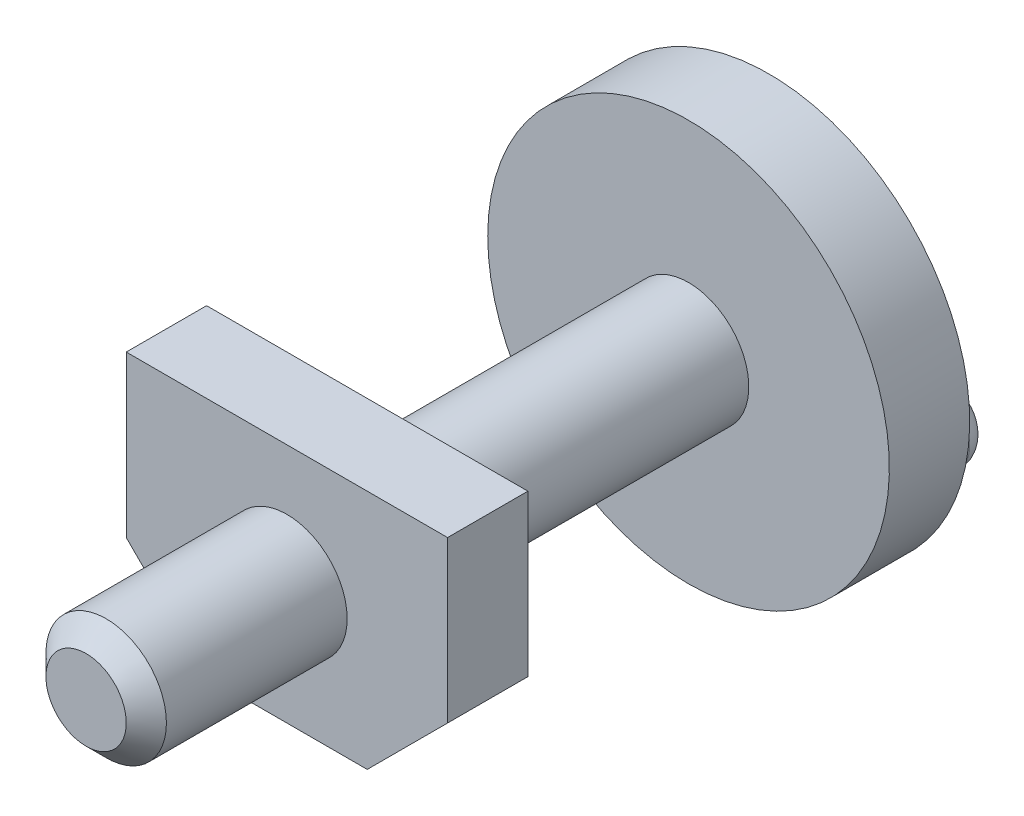
ISO-10303-21;
HEADER;
FILE_DESCRIPTION(('STEP AP214'),'2;1');
FILE_NAME('part.step','',(''),(''),'','','');
FILE_SCHEMA(('AUTOMOTIVE_DESIGN { 1 0 10303 214 1 1 1 1 }'));
ENDSEC;
DATA;
#1=APPLICATION_CONTEXT('core data for automotive mechanical design processes');
#2=APPLICATION_PROTOCOL_DEFINITION('international standard','automotive_design',2000,#1);
#3=PRODUCT_CONTEXT('',#1,'mechanical');
#4=PRODUCT('Part','Part','',(#3));
#5=PRODUCT_RELATED_PRODUCT_CATEGORY('part','',(#4));
#6=PRODUCT_DEFINITION_FORMATION('','',#4);
#7=PRODUCT_DEFINITION_CONTEXT('part definition',#1,'design');
#8=PRODUCT_DEFINITION('design','',#6,#7);
#9=PRODUCT_DEFINITION_SHAPE('','',#8);
#10=(LENGTH_UNIT() NAMED_UNIT(*) SI_UNIT(.MILLI.,.METRE.));
#11=(NAMED_UNIT(*) PLANE_ANGLE_UNIT() SI_UNIT($,.RADIAN.));
#12=(NAMED_UNIT(*) SI_UNIT($,.STERADIAN.) SOLID_ANGLE_UNIT());
#13=UNCERTAINTY_MEASURE_WITH_UNIT(LENGTH_MEASURE(1.E-05),#10,'distance_accuracy_value','');
#14=(GEOMETRIC_REPRESENTATION_CONTEXT(3) GLOBAL_UNCERTAINTY_ASSIGNED_CONTEXT((#13)) GLOBAL_UNIT_ASSIGNED_CONTEXT((#10,
#11,#12)) REPRESENTATION_CONTEXT('',''));
#15=CARTESIAN_POINT('',(0.,0.,0.));
#16=DIRECTION('',(0.,0.,1.));
#17=DIRECTION('',(1.,0.,0.));
#18=AXIS2_PLACEMENT_3D('',#15,#16,#17);
#19=CARTESIAN_POINT('',(0.,0.,150.));
#20=DIRECTION('',(0.,0.,-1.));
#21=DIRECTION('',(-1.,0.,0.));
#22=AXIS2_PLACEMENT_3D('',#19,#20,#21);
#23=CYLINDRICAL_SURFACE('',#22,15.);
#24=CARTESIAN_POINT('',(0.,0.,0.));
#25=DIRECTION('',(0.,0.,-1.));
#26=DIRECTION('',(-1.,0.,0.));
#27=AXIS2_PLACEMENT_3D('',#24,#25,#26);
#28=CIRCLE('',#27,15.);
#29=CARTESIAN_POINT('',(-15.,0.,0.));
#30=VERTEX_POINT('',#29);
#31=EDGE_CURVE('E146',#30,#30,#28,.T.);
#32=ORIENTED_EDGE('',*,*,#31,.F.);
#33=EDGE_LOOP('',(#32));
#34=FACE_BOUND('',#33,.T.);
#35=CARTESIAN_POINT('',(0.,0.,80.));
#36=DIRECTION('',(0.,0.,1.));
#37=DIRECTION('',(1.,0.,0.));
#38=AXIS2_PLACEMENT_3D('',#35,#36,#37);
#39=CIRCLE('',#38,15.);
#40=CARTESIAN_POINT('',(15.,0.,80.));
#41=VERTEX_POINT('',#40);
#42=EDGE_CURVE('E175',#41,#41,#39,.T.);
#43=ORIENTED_EDGE('',*,*,#42,.F.);
#44=EDGE_LOOP('',(#43));
#45=FACE_BOUND('',#44,.T.);
#46=ADVANCED_FACE('F37',(#34,#45),#23,.T.);
#47=CARTESIAN_POINT('',(0.,0.,-20.));
#48=DIRECTION('',(0.,0.,1.));
#49=DIRECTION('',(1.,0.,0.));
#50=AXIS2_PLACEMENT_3D('',#47,#48,#49);
#51=CYLINDRICAL_SURFACE('',#50,50.);
#52=CARTESIAN_POINT('',(0.,0.,-20.));
#53=DIRECTION('',(0.,0.,-1.));
#54=DIRECTION('',(-1.,0.,0.));
#55=AXIS2_PLACEMENT_3D('',#52,#53,#54);
#56=CIRCLE('',#55,50.);
#57=CARTESIAN_POINT('',(0.,-50.,-20.));
#58=VERTEX_POINT('',#57);
#59=EDGE_CURVE('E143',#58,#58,#56,.T.);
#60=ORIENTED_EDGE('',*,*,#59,.F.);
#61=EDGE_LOOP('',(#60));
#62=FACE_BOUND('',#61,.T.);
#63=CARTESIAN_POINT('',(0.,0.,0.));
#64=DIRECTION('',(0.,0.,-1.));
#65=DIRECTION('',(-1.,0.,0.));
#66=AXIS2_PLACEMENT_3D('',#63,#64,#65);
#67=CIRCLE('',#66,50.);
#68=CARTESIAN_POINT('',(-50.,0.,0.));
#69=VERTEX_POINT('',#68);
#70=EDGE_CURVE('E142',#69,#69,#67,.T.);
#71=ORIENTED_EDGE('',*,*,#70,.T.);
#72=EDGE_LOOP('',(#71));
#73=FACE_BOUND('',#72,.T.);
#74=ADVANCED_FACE('F218',(#62,#73),#51,.T.);
#75=CARTESIAN_POINT('',(0.,0.,-20.));
#76=DIRECTION('',(0.,0.,-1.));
#77=DIRECTION('',(-1.,0.,0.));
#78=AXIS2_PLACEMENT_3D('',#75,#76,#77);
#79=PLANE('',#78);
#80=CARTESIAN_POINT('',(0.,-46.25,-20.));
#81=DIRECTION('',(0.,0.,-1.));
#82=DIRECTION('',(-1.,0.,0.));
#83=AXIS2_PLACEMENT_3D('',#80,#81,#82);
#84=CIRCLE('',#83,3.75);
#85=CARTESIAN_POINT('',(0.,-42.5,-20.));
#86=VERTEX_POINT('',#85);
#87=EDGE_CURVE('E132',#86,#58,#84,.T.);
#88=ORIENTED_EDGE('',*,*,#87,.F.);
#89=CARTESIAN_POINT('',(0.,0.,-20.));
#90=DIRECTION('',(0.,0.,-1.));
#91=DIRECTION('',(-1.,0.,0.));
#92=AXIS2_PLACEMENT_3D('',#89,#90,#91);
#93=CIRCLE('',#92,42.5);
#94=EDGE_CURVE('E139',#86,#86,#93,.T.);
#95=ORIENTED_EDGE('',*,*,#94,.F.);
#96=EDGE_CURVE('E136',#58,#86,#84,.T.);
#97=ORIENTED_EDGE('',*,*,#96,.F.);
#98=ORIENTED_EDGE('',*,*,#59,.T.);
#99=EDGE_LOOP('',(#88,#95,#97,#98));
#100=FACE_BOUND('',#99,.T.);
#101=ADVANCED_FACE('F223',(#100),#79,.T.);
#102=CARTESIAN_POINT('',(0.,0.,0.));
#103=DIRECTION('',(0.,0.,-1.));
#104=DIRECTION('',(-1.,0.,0.));
#105=AXIS2_PLACEMENT_3D('',#102,#103,#104);
#106=PLANE('',#105);
#107=ORIENTED_EDGE('',*,*,#31,.T.);
#108=EDGE_LOOP('',(#107));
#109=FACE_BOUND('',#108,.T.);
#110=ORIENTED_EDGE('',*,*,#70,.F.);
#111=EDGE_LOOP('',(#110));
#112=FACE_BOUND('',#111,.T.);
#113=ADVANCED_FACE('F295',(#109,#112),#106,.F.);
#114=CARTESIAN_POINT('',(0.,0.,-15.));
#115=DIRECTION('',(0.,0.,-1.));
#116=DIRECTION('',(-1.,0.,0.));
#117=AXIS2_PLACEMENT_3D('',#114,#115,#116);
#118=PLANE('',#117);
#119=CARTESIAN_POINT('',(0.,0.,-15.));
#120=DIRECTION('',(0.,0.,-1.));
#121=DIRECTION('',(-1.,0.,0.));
#122=AXIS2_PLACEMENT_3D('',#119,#120,#121);
#123=CIRCLE('',#122,30.);
#124=CARTESIAN_POINT('',(-30.,0.,-15.));
#125=VERTEX_POINT('',#124);
#126=EDGE_CURVE('E154',#125,#125,#123,.F.);
#127=ORIENTED_EDGE('',*,*,#126,.T.);
#128=EDGE_LOOP('',(#127));
#129=FACE_BOUND('',#128,.T.);
#130=CARTESIAN_POINT('',(0.,0.,-15.));
#131=DIRECTION('',(0.,0.,-1.));
#132=DIRECTION('',(-1.,0.,0.));
#133=AXIS2_PLACEMENT_3D('',#130,#131,#132);
#134=CIRCLE('',#133,37.5);
#135=CARTESIAN_POINT('',(-37.5,0.,-15.));
#136=VERTEX_POINT('',#135);
#137=EDGE_CURVE('E151',#136,#136,#134,.T.);
#138=ORIENTED_EDGE('',*,*,#137,.T.);
#139=EDGE_LOOP('',(#138));
#140=FACE_BOUND('',#139,.T.);
#141=ADVANCED_FACE('F292',(#129,#140),#118,.T.);
#142=CARTESIAN_POINT('',(0.,0.,-20.));
#143=DIRECTION('',(0.,0.,-1.));
#144=DIRECTION('',(-1.,0.,0.));
#145=AXIS2_PLACEMENT_3D('',#142,#143,#144);
#146=CIRCLE('',#145,25.);
#147=CARTESIAN_POINT('',(-25.,0.,-20.));
#148=VERTEX_POINT('',#147);
#149=EDGE_CURVE('E135',#148,#148,#146,.T.);
#150=ORIENTED_EDGE('',*,*,#149,.T.);
#151=EDGE_LOOP('',(#150));
#152=FACE_BOUND('',#151,.T.);
#153=ADVANCED_FACE('F235',(#152),#79,.T.);
#154=CARTESIAN_POINT('',(0.,0.,-20.));
#155=DIRECTION('',(0.,0.,1.));
#156=DIRECTION('',(1.,0.,0.));
#157=AXIS2_PLACEMENT_3D('',#154,#155,#156);
#158=CONICAL_SURFACE('',#157,25.,0.785398163397447);
#159=ORIENTED_EDGE('',*,*,#126,.F.);
#160=EDGE_LOOP('',(#159));
#161=FACE_BOUND('',#160,.T.);
#162=ORIENTED_EDGE('',*,*,#149,.F.);
#163=EDGE_LOOP('',(#162));
#164=FACE_BOUND('',#163,.T.);
#165=ADVANCED_FACE('F231',(#161,#164),#158,.T.);
#166=CARTESIAN_POINT('',(0.,0.,-15.));
#167=DIRECTION('',(0.,0.,-1.));
#168=DIRECTION('',(-1.,0.,0.));
#169=AXIS2_PLACEMENT_3D('',#166,#167,#168);
#170=CONICAL_SURFACE('',#169,37.5,0.785398163397454);
#171=ORIENTED_EDGE('',*,*,#94,.T.);
#172=EDGE_LOOP('',(#171));
#173=FACE_BOUND('',#172,.T.);
#174=ORIENTED_EDGE('',*,*,#137,.F.);
#175=EDGE_LOOP('',(#174));
#176=FACE_BOUND('',#175,.T.);
#177=ADVANCED_FACE('F234',(#173,#176),#170,.F.);
#178=CARTESIAN_POINT('',(0.,-46.25,-30.));
#179=DIRECTION('',(0.,0.,1.));
#180=DIRECTION('',(1.,0.,0.));
#181=AXIS2_PLACEMENT_3D('',#178,#179,#180);
#182=CYLINDRICAL_SURFACE('',#181,3.75);
#183=CARTESIAN_POINT('',(0.,-46.25,-25.));
#184=DIRECTION('',(0.,0.,-1.));
#185=DIRECTION('',(-1.,0.,0.));
#186=AXIS2_PLACEMENT_3D('',#183,#184,#185);
#187=CIRCLE('',#186,3.75);
#188=CARTESIAN_POINT('',(-3.74999999999999,-46.25,-25.));
#189=VERTEX_POINT('',#188);
#190=EDGE_CURVE('E166',#189,#189,#187,.F.);
#191=ORIENTED_EDGE('',*,*,#190,.T.);
#192=EDGE_LOOP('',(#191));
#193=FACE_BOUND('',#192,.T.);
#194=ORIENTED_EDGE('',*,*,#87,.T.);
#195=ORIENTED_EDGE('',*,*,#96,.T.);
#196=EDGE_LOOP('',(#194,#195));
#197=FACE_BOUND('',#196,.T.);
#198=ADVANCED_FACE('F239',(#193,#197),#182,.T.);
#199=CARTESIAN_POINT('',(0.,-46.25,-66.));
#200=DIRECTION('',(0.,0.,1.));
#201=DIRECTION('',(1.,0.,0.));
#202=AXIS2_PLACEMENT_3D('',#199,#200,#201);
#203=CYLINDRICAL_SURFACE('',#202,9.);
#204=CARTESIAN_POINT('',(0.,-46.25,-61.));
#205=DIRECTION('',(0.,0.,-1.));
#206=DIRECTION('',(-1.,0.,0.));
#207=AXIS2_PLACEMENT_3D('',#204,#205,#206);
#208=CIRCLE('',#207,9.);
#209=CARTESIAN_POINT('',(-9.,-46.25,-61.));
#210=VERTEX_POINT('',#209);
#211=EDGE_CURVE('E160',#210,#210,#208,.F.);
#212=ORIENTED_EDGE('',*,*,#211,.T.);
#213=EDGE_LOOP('',(#212));
#214=FACE_BOUND('',#213,.T.);
#215=CARTESIAN_POINT('',(0.,-46.25,-30.));
#216=DIRECTION('',(0.,0.,-1.));
#217=DIRECTION('',(-1.,0.,0.));
#218=AXIS2_PLACEMENT_3D('',#215,#216,#217);
#219=CIRCLE('',#218,9.);
#220=CARTESIAN_POINT('',(-9.,-46.25,-30.));
#221=VERTEX_POINT('',#220);
#222=EDGE_CURVE('E124',#221,#221,#219,.T.);
#223=ORIENTED_EDGE('',*,*,#222,.T.);
#224=EDGE_LOOP('',(#223));
#225=FACE_BOUND('',#224,.T.);
#226=ADVANCED_FACE('F281',(#214,#225),#203,.T.);
#227=CARTESIAN_POINT('',(0.,-46.25,-66.));
#228=DIRECTION('',(0.,0.,-1.));
#229=DIRECTION('',(-1.,0.,0.));
#230=AXIS2_PLACEMENT_3D('',#227,#228,#229);
#231=PLANE('',#230);
#232=CARTESIAN_POINT('',(0.,-46.25,-66.));
#233=DIRECTION('',(0.,0.,-1.));
#234=DIRECTION('',(-1.,0.,0.));
#235=AXIS2_PLACEMENT_3D('',#232,#233,#234);
#236=CIRCLE('',#235,4.);
#237=CARTESIAN_POINT('',(-4.,-46.25,-66.));
#238=VERTEX_POINT('',#237);
#239=EDGE_CURVE('E157',#238,#238,#236,.T.);
#240=ORIENTED_EDGE('',*,*,#239,.T.);
#241=EDGE_LOOP('',(#240));
#242=FACE_BOUND('',#241,.T.);
#243=ADVANCED_FACE('F278',(#242),#231,.T.);
#244=CARTESIAN_POINT('',(0.,-46.25,-30.));
#245=DIRECTION('',(0.,0.,-1.));
#246=DIRECTION('',(-1.,0.,0.));
#247=AXIS2_PLACEMENT_3D('',#244,#245,#246);
#248=PLANE('',#247);
#249=CARTESIAN_POINT('',(0.,-46.25,-30.));
#250=DIRECTION('',(0.,0.,-1.));
#251=DIRECTION('',(-1.,0.,0.));
#252=AXIS2_PLACEMENT_3D('',#249,#250,#251);
#253=CIRCLE('',#252,8.75000000000004);
#254=CARTESIAN_POINT('',(-8.75000000000003,-46.25,-30.));
#255=VERTEX_POINT('',#254);
#256=EDGE_CURVE('E163',#255,#255,#253,.T.);
#257=ORIENTED_EDGE('',*,*,#256,.T.);
#258=EDGE_LOOP('',(#257));
#259=FACE_BOUND('',#258,.T.);
#260=ORIENTED_EDGE('',*,*,#222,.F.);
#261=EDGE_LOOP('',(#260));
#262=FACE_BOUND('',#261,.T.);
#263=ADVANCED_FACE('F245',(#259,#262),#248,.F.);
#264=CARTESIAN_POINT('',(0.,-46.25,-61.));
#265=DIRECTION('',(0.,0.,-1.));
#266=DIRECTION('',(-1.,0.,0.));
#267=AXIS2_PLACEMENT_3D('',#264,#265,#266);
#268=DEGENERATE_TOROIDAL_SURFACE('',#267,4.,5.,.T.);
#269=ORIENTED_EDGE('',*,*,#211,.F.);
#270=EDGE_LOOP('',(#269));
#271=FACE_BOUND('',#270,.T.);
#272=ORIENTED_EDGE('',*,*,#239,.F.);
#273=EDGE_LOOP('',(#272));
#274=FACE_BOUND('',#273,.T.);
#275=ADVANCED_FACE('F241',(#271,#274),#268,.T.);
#276=CARTESIAN_POINT('',(0.,-46.25,-30.));
#277=DIRECTION('',(0.,0.,-1.));
#278=DIRECTION('',(-1.,0.,0.));
#279=AXIS2_PLACEMENT_3D('',#276,#277,#278);
#280=CONICAL_SURFACE('',#279,8.75000000000004,0.785398163397453);
#281=CARTESIAN_POINT('',(-3.74999999999999,-46.25,-25.));
#282=CARTESIAN_POINT('',(-3.80208333333333,-46.25,-25.0520833333333));
#283=CARTESIAN_POINT('',(-3.85416666666666,-46.25,-25.1041666666667));
#284=CARTESIAN_POINT('',(-3.95833333333333,-46.25,-25.2083333333333));
#285=CARTESIAN_POINT('',(-4.01041666666666,-46.25,-25.2604166666667));
#286=CARTESIAN_POINT('',(-4.11458333333333,-46.25,-25.3645833333333));
#287=CARTESIAN_POINT('',(-4.16666666666666,-46.25,-25.4166666666667));
#288=CARTESIAN_POINT('',(-4.27083333333333,-46.25,-25.5208333333333));
#289=CARTESIAN_POINT('',(-4.32291666666666,-46.25,-25.5729166666667));
#290=CARTESIAN_POINT('',(-4.42708333333333,-46.25,-25.6770833333333));
#291=CARTESIAN_POINT('',(-4.47916666666667,-46.25,-25.7291666666667));
#292=CARTESIAN_POINT('',(-4.58333333333333,-46.25,-25.8333333333333));
#293=CARTESIAN_POINT('',(-4.63541666666667,-46.25,-25.8854166666667));
#294=CARTESIAN_POINT('',(-4.73958333333333,-46.25,-25.9895833333333));
#295=CARTESIAN_POINT('',(-4.79166666666667,-46.25,-26.0416666666667));
#296=CARTESIAN_POINT('',(-4.89583333333334,-46.25,-26.1458333333333));
#297=CARTESIAN_POINT('',(-4.94791666666667,-46.25,-26.1979166666667));
#298=CARTESIAN_POINT('',(-5.05208333333334,-46.25,-26.3020833333333));
#299=CARTESIAN_POINT('',(-5.10416666666667,-46.25,-26.3541666666667));
#300=CARTESIAN_POINT('',(-5.20833333333334,-46.25,-26.4583333333333));
#301=CARTESIAN_POINT('',(-5.26041666666667,-46.25,-26.5104166666667));
#302=CARTESIAN_POINT('',(-5.36458333333334,-46.25,-26.6145833333333));
#303=CARTESIAN_POINT('',(-5.41666666666667,-46.25,-26.6666666666667));
#304=CARTESIAN_POINT('',(-5.52083333333334,-46.25,-26.7708333333333));
#305=CARTESIAN_POINT('',(-5.57291666666667,-46.25,-26.8229166666667));
#306=CARTESIAN_POINT('',(-5.67708333333334,-46.25,-26.9270833333333));
#307=CARTESIAN_POINT('',(-5.72916666666668,-46.25,-26.9791666666667));
#308=CARTESIAN_POINT('',(-5.83333333333334,-46.25,-27.0833333333333));
#309=CARTESIAN_POINT('',(-5.88541666666668,-46.25,-27.1354166666667));
#310=CARTESIAN_POINT('',(-5.98958333333334,-46.25,-27.2395833333333));
#311=CARTESIAN_POINT('',(-6.04166666666668,-46.25,-27.2916666666667));
#312=CARTESIAN_POINT('',(-6.14583333333335,-46.25,-27.3958333333333));
#313=CARTESIAN_POINT('',(-6.19791666666668,-46.25,-27.4479166666667));
#314=CARTESIAN_POINT('',(-6.30208333333335,-46.25,-27.5520833333333));
#315=CARTESIAN_POINT('',(-6.35416666666668,-46.25,-27.6041666666667));
#316=CARTESIAN_POINT('',(-6.45833333333335,-46.25,-27.7083333333333));
#317=CARTESIAN_POINT('',(-6.51041666666668,-46.25,-27.7604166666667));
#318=CARTESIAN_POINT('',(-6.61458333333335,-46.25,-27.8645833333333));
#319=CARTESIAN_POINT('',(-6.66666666666668,-46.25,-27.9166666666667));
#320=CARTESIAN_POINT('',(-6.77083333333335,-46.25,-28.0208333333333));
#321=CARTESIAN_POINT('',(-6.82291666666668,-46.25,-28.0729166666667));
#322=CARTESIAN_POINT('',(-6.92708333333335,-46.25,-28.1770833333333));
#323=CARTESIAN_POINT('',(-6.97916666666669,-46.25,-28.2291666666667));
#324=CARTESIAN_POINT('',(-7.08333333333335,-46.25,-28.3333333333333));
#325=CARTESIAN_POINT('',(-7.13541666666669,-46.25,-28.3854166666667));
#326=CARTESIAN_POINT('',(-7.23958333333336,-46.25,-28.4895833333333));
#327=CARTESIAN_POINT('',(-7.29166666666669,-46.25,-28.5416666666667));
#328=CARTESIAN_POINT('',(-7.39583333333336,-46.25,-28.6458333333333));
#329=CARTESIAN_POINT('',(-7.44791666666669,-46.25,-28.6979166666667));
#330=CARTESIAN_POINT('',(-7.55208333333336,-46.25,-28.8020833333333));
#331=CARTESIAN_POINT('',(-7.60416666666669,-46.25,-28.8541666666667));
#332=CARTESIAN_POINT('',(-7.70833333333336,-46.25,-28.9583333333333));
#333=CARTESIAN_POINT('',(-7.76041666666669,-46.25,-29.0104166666667));
#334=CARTESIAN_POINT('',(-7.86458333333336,-46.25,-29.1145833333333));
#335=CARTESIAN_POINT('',(-7.91666666666669,-46.25,-29.1666666666667));
#336=CARTESIAN_POINT('',(-8.02083333333336,-46.25,-29.2708333333333));
#337=CARTESIAN_POINT('',(-8.07291666666669,-46.25,-29.3229166666667));
#338=CARTESIAN_POINT('',(-8.17708333333336,-46.25,-29.4270833333333));
#339=CARTESIAN_POINT('',(-8.2291666666667,-46.25,-29.4791666666667));
#340=CARTESIAN_POINT('',(-8.33333333333336,-46.25,-29.5833333333333));
#341=CARTESIAN_POINT('',(-8.3854166666667,-46.25,-29.6354166666667));
#342=CARTESIAN_POINT('',(-8.48958333333336,-46.25,-29.7395833333333));
#343=CARTESIAN_POINT('',(-8.5416666666667,-46.25,-29.7916666666667));
#344=CARTESIAN_POINT('',(-8.64583333333336,-46.25,-29.8958333333333));
#345=CARTESIAN_POINT('',(-8.6979166666667,-46.25,-29.9479166666667));
#346=CARTESIAN_POINT('',(-8.75000000000003,-46.25,-30.));
#347=B_SPLINE_CURVE_WITH_KNOTS('',3,(#281,#282,#283,#284,#285,#286,#287,#288,#289,#290,#291,
#292,#293,#294,#295,#296,#297,#298,#299,#300,#301,#302,#303,#304,#305,#306,#307,#308,#309,#310,
#311,#312,#313,#314,#315,#316,#317,#318,#319,#320,#321,#322,#323,#324,#325,#326,#327,#328,#329,
#330,#331,#332,#333,#334,#335,#336,#337,#338,#339,#340,#341,#342,#343,#344,#345,#346),
.UNSPECIFIED.,.F.,.F.,(4,2,2,2,2,2,2,2,2,2,2,2,2,2,2,2,2,2,2,2,2,2,2,2,2,2,2,2,2,2,2,2,4),(0.,
0.220970869120798,0.441941738241592,0.662912607362391,0.883883476483186,1.10485434560398,
1.32582521472478,1.54679608384558,1.76776695296637,1.98873782208717,2.20970869120797,
2.43067956032877,2.65165042944956,2.87262129857036,3.09359216769115,3.31456303681195,
3.53553390593275,3.75650477505355,3.97747564417434,4.19844651329514,4.41941738241594,
4.64038825153674,4.86135912065753,5.08232998977833,5.30330085889913,5.52427172801992,
5.74524259714072,5.96621346626152,6.18718433538232,6.40815520450311,6.62912607362391,
6.85009694274471,7.0710678118655),.UNSPECIFIED.);
#348=EDGE_CURVE('BSEAM244',#189,#255,#347,.T.);
#349=ORIENTED_EDGE('',*,*,#190,.F.);
#350=ORIENTED_EDGE('',*,*,#256,.F.);
#351=ORIENTED_EDGE('',*,*,#348,.T.);
#352=ORIENTED_EDGE('',*,*,#348,.F.);
#353=EDGE_LOOP('',(#349,#351,#350,#352));
#354=FACE_BOUND('',#353,.T.);
#355=ADVANCED_FACE('F244',(#354),#280,.T.);
#356=CARTESIAN_POINT('',(40.,30.,100.));
#357=DIRECTION('',(-1.,0.,0.));
#358=DIRECTION('',(0.,0.,1.));
#359=AXIS2_PLACEMENT_3D('',#356,#357,#358);
#360=PLANE('',#359);
#361=DIRECTION('',(0.,1.,0.));
#362=VECTOR('',#361,1.);
#363=CARTESIAN_POINT('',(40.,30.,100.));
#364=LINE('',#363,#362);
#365=CARTESIAN_POINT('',(40.,-9.99999999999995,100.));
#366=VERTEX_POINT('',#365);
#367=CARTESIAN_POINT('',(40.,30.,100.));
#368=VERTEX_POINT('',#367);
#369=EDGE_CURVE('E97',#366,#368,#364,.T.);
#370=ORIENTED_EDGE('',*,*,#369,.F.);
#371=DIRECTION('',(0.,0.,-1.));
#372=VECTOR('',#371,1.);
#373=CARTESIAN_POINT('',(40.,-9.99999999999995,100.));
#374=LINE('',#373,#372);
#375=CARTESIAN_POINT('',(40.,-9.99999999999995,80.));
#376=VERTEX_POINT('',#375);
#377=EDGE_CURVE('E177',#366,#376,#374,.T.);
#378=ORIENTED_EDGE('',*,*,#377,.T.);
#379=DIRECTION('',(0.,1.,0.));
#380=VECTOR('',#379,1.);
#381=CARTESIAN_POINT('',(40.,30.,80.));
#382=LINE('',#381,#380);
#383=CARTESIAN_POINT('',(40.,30.,80.));
#384=VERTEX_POINT('',#383);
#385=EDGE_CURVE('E119',#376,#384,#382,.T.);
#386=ORIENTED_EDGE('',*,*,#385,.T.);
#387=DIRECTION('',(0.,0.,-1.));
#388=VECTOR('',#387,1.);
#389=CARTESIAN_POINT('',(40.,30.,100.));
#390=LINE('',#389,#388);
#391=EDGE_CURVE('E112',#368,#384,#390,.T.);
#392=ORIENTED_EDGE('',*,*,#391,.F.);
#393=EDGE_LOOP('',(#370,#378,#386,#392));
#394=FACE_BOUND('',#393,.T.);
#395=ADVANCED_FACE('F117',(#394),#360,.F.);
#396=CARTESIAN_POINT('',(-40.,30.,100.));
#397=DIRECTION('',(0.,-1.,0.));
#398=DIRECTION('',(0.,0.,-1.));
#399=AXIS2_PLACEMENT_3D('',#396,#397,#398);
#400=PLANE('',#399);
#401=DIRECTION('',(-1.,0.,0.));
#402=VECTOR('',#401,1.);
#403=CARTESIAN_POINT('',(-40.,30.,80.));
#404=LINE('',#403,#402);
#405=CARTESIAN_POINT('',(-40.,30.,80.));
#406=VERTEX_POINT('',#405);
#407=EDGE_CURVE('E200',#384,#406,#404,.T.);
#408=ORIENTED_EDGE('',*,*,#407,.T.);
#409=DIRECTION('',(0.,0.,-1.));
#410=VECTOR('',#409,1.);
#411=CARTESIAN_POINT('',(-40.,30.,100.));
#412=LINE('',#411,#410);
#413=CARTESIAN_POINT('',(-40.,30.,100.));
#414=VERTEX_POINT('',#413);
#415=EDGE_CURVE('E114',#414,#406,#412,.T.);
#416=ORIENTED_EDGE('',*,*,#415,.F.);
#417=DIRECTION('',(-1.,0.,0.));
#418=VECTOR('',#417,1.);
#419=CARTESIAN_POINT('',(-40.,30.,100.));
#420=LINE('',#419,#418);
#421=EDGE_CURVE('E100',#368,#414,#420,.T.);
#422=ORIENTED_EDGE('',*,*,#421,.F.);
#423=ORIENTED_EDGE('',*,*,#391,.T.);
#424=EDGE_LOOP('',(#408,#416,#422,#423));
#425=FACE_BOUND('',#424,.T.);
#426=ADVANCED_FACE('F111',(#425),#400,.F.);
#427=CARTESIAN_POINT('',(-40.,30.,100.));
#428=DIRECTION('',(1.,0.,0.));
#429=DIRECTION('',(0.,0.,-1.));
#430=AXIS2_PLACEMENT_3D('',#427,#428,#429);
#431=PLANE('',#430);
#432=DIRECTION('',(0.,-1.,0.));
#433=VECTOR('',#432,1.);
#434=CARTESIAN_POINT('',(-40.,30.,80.));
#435=LINE('',#434,#433);
#436=CARTESIAN_POINT('',(-40.,-9.99999999999995,80.));
#437=VERTEX_POINT('',#436);
#438=EDGE_CURVE('E198',#406,#437,#435,.T.);
#439=ORIENTED_EDGE('',*,*,#438,.T.);
#440=DIRECTION('',(0.,0.,1.));
#441=VECTOR('',#440,1.);
#442=CARTESIAN_POINT('',(-40.,-9.99999999999995,100.));
#443=LINE('',#442,#441);
#444=CARTESIAN_POINT('',(-40.,-9.99999999999995,100.));
#445=VERTEX_POINT('',#444);
#446=EDGE_CURVE('E11',#437,#445,#443,.T.);
#447=ORIENTED_EDGE('',*,*,#446,.T.);
#448=DIRECTION('',(0.,-1.,0.));
#449=VECTOR('',#448,1.);
#450=CARTESIAN_POINT('',(-40.,30.,100.));
#451=LINE('',#450,#449);
#452=EDGE_CURVE('E115',#414,#445,#451,.T.);
#453=ORIENTED_EDGE('',*,*,#452,.F.);
#454=ORIENTED_EDGE('',*,*,#415,.T.);
#455=EDGE_LOOP('',(#439,#447,#453,#454));
#456=FACE_BOUND('',#455,.T.);
#457=ADVANCED_FACE('F199',(#456),#431,.F.);
#458=CARTESIAN_POINT('',(-40.,-30.,100.));
#459=DIRECTION('',(0.,1.,0.));
#460=DIRECTION('',(0.,0.,1.));
#461=AXIS2_PLACEMENT_3D('',#458,#459,#460);
#462=PLANE('',#461);
#463=DIRECTION('',(1.,0.,0.));
#464=VECTOR('',#463,1.);
#465=CARTESIAN_POINT('',(-40.,-30.,80.));
#466=LINE('',#465,#464);
#467=CARTESIAN_POINT('',(-20.,-30.,80.));
#468=VERTEX_POINT('',#467);
#469=CARTESIAN_POINT('',(19.9999999999999,-30.,80.));
#470=VERTEX_POINT('',#469);
#471=EDGE_CURVE('E107',#468,#470,#466,.T.);
#472=ORIENTED_EDGE('',*,*,#471,.T.);
#473=DIRECTION('',(0.,0.,1.));
#474=VECTOR('',#473,1.);
#475=CARTESIAN_POINT('',(19.9999999999999,-30.,100.));
#476=LINE('',#475,#474);
#477=CARTESIAN_POINT('',(19.9999999999999,-30.,100.));
#478=VERTEX_POINT('',#477);
#479=EDGE_CURVE('E58',#470,#478,#476,.T.);
#480=ORIENTED_EDGE('',*,*,#479,.T.);
#481=DIRECTION('',(1.,0.,0.));
#482=VECTOR('',#481,1.);
#483=CARTESIAN_POINT('',(-40.,-30.,100.));
#484=LINE('',#483,#482);
#485=CARTESIAN_POINT('',(-20.,-30.,100.));
#486=VERTEX_POINT('',#485);
#487=EDGE_CURVE('E126',#486,#478,#484,.T.);
#488=ORIENTED_EDGE('',*,*,#487,.F.);
#489=DIRECTION('',(0.,0.,-1.));
#490=VECTOR('',#489,1.);
#491=CARTESIAN_POINT('',(-20.,-30.,100.));
#492=LINE('',#491,#490);
#493=EDGE_CURVE('E184',#486,#468,#492,.T.);
#494=ORIENTED_EDGE('',*,*,#493,.T.);
#495=EDGE_LOOP('',(#472,#480,#488,#494));
#496=FACE_BOUND('',#495,.T.);
#497=ADVANCED_FACE('F192',(#496),#462,.F.);
#498=CARTESIAN_POINT('',(0.,0.,100.));
#499=DIRECTION('',(0.,0.,1.));
#500=DIRECTION('',(1.,0.,0.));
#501=AXIS2_PLACEMENT_3D('',#498,#499,#500);
#502=PLANE('',#501);
#503=CARTESIAN_POINT('',(0.,0.,100.));
#504=DIRECTION('',(0.,0.,1.));
#505=DIRECTION('',(1.,0.,0.));
#506=AXIS2_PLACEMENT_3D('',#503,#504,#505);
#507=CIRCLE('',#506,15.);
#508=CARTESIAN_POINT('',(15.,0.,100.));
#509=VERTEX_POINT('',#508);
#510=EDGE_CURVE('E121',#509,#509,#507,.T.);
#511=ORIENTED_EDGE('',*,*,#510,.F.);
#512=EDGE_LOOP('',(#511));
#513=FACE_BOUND('',#512,.T.);
#514=ORIENTED_EDGE('',*,*,#487,.T.);
#515=DIRECTION('',(-0.707106781186549,-0.707106781186546,0.));
#516=VECTOR('',#515,1.);
#517=CARTESIAN_POINT('',(24.9999999999999,-25.,100.));
#518=LINE('',#517,#516);
#519=EDGE_CURVE('E45',#478,#366,#518,.F.);
#520=ORIENTED_EDGE('',*,*,#519,.T.);
#521=ORIENTED_EDGE('',*,*,#369,.T.);
#522=ORIENTED_EDGE('',*,*,#421,.T.);
#523=ORIENTED_EDGE('',*,*,#452,.T.);
#524=DIRECTION('',(-0.707106781186547,0.707106781186549,0.));
#525=VECTOR('',#524,1.);
#526=CARTESIAN_POINT('',(-25.,-25.,100.));
#527=LINE('',#526,#525);
#528=EDGE_CURVE('E188',#445,#486,#527,.F.);
#529=ORIENTED_EDGE('',*,*,#528,.T.);
#530=EDGE_LOOP('',(#514,#520,#521,#522,#523,#529));
#531=FACE_BOUND('',#530,.T.);
#532=ADVANCED_FACE('F99',(#513,#531),#502,.T.);
#533=CARTESIAN_POINT('',(0.,0.,80.));
#534=DIRECTION('',(0.,0.,1.));
#535=DIRECTION('',(1.,0.,0.));
#536=AXIS2_PLACEMENT_3D('',#533,#534,#535);
#537=PLANE('',#536);
#538=ORIENTED_EDGE('',*,*,#42,.T.);
#539=EDGE_LOOP('',(#538));
#540=FACE_BOUND('',#539,.T.);
#541=ORIENTED_EDGE('',*,*,#385,.F.);
#542=DIRECTION('',(0.707106781186549,0.707106781186546,0.));
#543=VECTOR('',#542,1.);
#544=CARTESIAN_POINT('',(40.,-9.99999999999995,80.));
#545=LINE('',#544,#543);
#546=EDGE_CURVE('E182',#376,#470,#545,.F.);
#547=ORIENTED_EDGE('',*,*,#546,.T.);
#548=ORIENTED_EDGE('',*,*,#471,.F.);
#549=DIRECTION('',(0.707106781186547,-0.707106781186549,0.));
#550=VECTOR('',#549,1.);
#551=CARTESIAN_POINT('',(-20.,-30.,80.));
#552=LINE('',#551,#550);
#553=EDGE_CURVE('E180',#468,#437,#552,.F.);
#554=ORIENTED_EDGE('',*,*,#553,.T.);
#555=ORIENTED_EDGE('',*,*,#438,.F.);
#556=ORIENTED_EDGE('',*,*,#407,.F.);
#557=EDGE_LOOP('',(#541,#547,#548,#554,#555,#556));
#558=FACE_BOUND('',#557,.T.);
#559=ADVANCED_FACE('F197',(#540,#558),#537,.F.);
#560=CARTESIAN_POINT('',(0.,0.,150.));
#561=DIRECTION('',(0.,0.,1.));
#562=DIRECTION('',(1.,0.,0.));
#563=AXIS2_PLACEMENT_3D('',#560,#561,#562);
#564=PLANE('',#563);
#565=CARTESIAN_POINT('',(0.,0.,150.));
#566=DIRECTION('',(0.,0.,1.));
#567=DIRECTION('',(1.,0.,0.));
#568=AXIS2_PLACEMENT_3D('',#565,#566,#567);
#569=CIRCLE('',#568,9.99999999999995);
#570=CARTESIAN_POINT('',(9.99999999999995,0.,150.));
#571=VERTEX_POINT('',#570);
#572=EDGE_CURVE('E169',#571,#571,#569,.T.);
#573=ORIENTED_EDGE('',*,*,#572,.T.);
#574=EDGE_LOOP('',(#573));
#575=FACE_BOUND('',#574,.T.);
#576=ADVANCED_FACE('F230',(#575),#564,.T.);
#577=CARTESIAN_POINT('',(0.,0.,150.));
#578=DIRECTION('',(0.,0.,-1.));
#579=DIRECTION('',(-1.,0.,0.));
#580=AXIS2_PLACEMENT_3D('',#577,#578,#579);
#581=CONICAL_SURFACE('',#580,9.99999999999995,0.785398163397447);
#582=CARTESIAN_POINT('',(0.,0.,145.));
#583=DIRECTION('',(0.,0.,1.));
#584=DIRECTION('',(1.,0.,0.));
#585=AXIS2_PLACEMENT_3D('',#582,#583,#584);
#586=CIRCLE('',#585,15.);
#587=CARTESIAN_POINT('',(15.,0.,145.));
#588=VERTEX_POINT('',#587);
#589=EDGE_CURVE('E172',#588,#588,#586,.F.);
#590=ORIENTED_EDGE('',*,*,#589,.F.);
#591=EDGE_LOOP('',(#590));
#592=FACE_BOUND('',#591,.T.);
#593=ORIENTED_EDGE('',*,*,#572,.F.);
#594=EDGE_LOOP('',(#593));
#595=FACE_BOUND('',#594,.T.);
#596=ADVANCED_FACE('F213',(#592,#595),#581,.T.);
#597=ORIENTED_EDGE('',*,*,#510,.T.);
#598=EDGE_LOOP('',(#597));
#599=FACE_BOUND('',#598,.T.);
#600=ORIENTED_EDGE('',*,*,#589,.T.);
#601=EDGE_LOOP('',(#600));
#602=FACE_BOUND('',#601,.T.);
#603=ADVANCED_FACE('F208',(#599,#602),#23,.T.);
#604=CARTESIAN_POINT('',(40.,-9.99999999999995,100.));
#605=DIRECTION('',(-0.707106781186546,0.707106781186549,0.));
#606=DIRECTION('',(0.,0.,-1.));
#607=AXIS2_PLACEMENT_3D('',#604,#605,#606);
#608=PLANE('',#607);
#609=ORIENTED_EDGE('',*,*,#519,.F.);
#610=ORIENTED_EDGE('',*,*,#479,.F.);
#611=ORIENTED_EDGE('',*,*,#546,.F.);
#612=ORIENTED_EDGE('',*,*,#377,.F.);
#613=EDGE_LOOP('',(#609,#610,#611,#612));
#614=FACE_BOUND('',#613,.T.);
#615=ADVANCED_FACE('F206',(#614),#608,.F.);
#616=CARTESIAN_POINT('',(-20.,-30.,100.));
#617=DIRECTION('',(0.707106781186548,0.707106781186546,0.));
#618=DIRECTION('',(0.,0.,-1.));
#619=AXIS2_PLACEMENT_3D('',#616,#617,#618);
#620=PLANE('',#619);
#621=ORIENTED_EDGE('',*,*,#528,.F.);
#622=ORIENTED_EDGE('',*,*,#446,.F.);
#623=ORIENTED_EDGE('',*,*,#553,.F.);
#624=ORIENTED_EDGE('',*,*,#493,.F.);
#625=EDGE_LOOP('',(#621,#622,#623,#624));
#626=FACE_BOUND('',#625,.T.);
#627=ADVANCED_FACE('F39',(#626),#620,.F.);
#628=CLOSED_SHELL('',(#46,#74,#101,#113,#141,#153,#165,#177,#198,#226,#243,#263,#275,#355,#395,
#426,#457,#497,#532,#559,#576,#596,#603,#615,#627));
#629=MANIFOLD_SOLID_BREP('B2',#628);
#630=ADVANCED_BREP_SHAPE_REPRESENTATION('',(#18,#629),#14);
#631=SHAPE_DEFINITION_REPRESENTATION(#9,#630);
ENDSEC;
END-ISO-10303-21;
